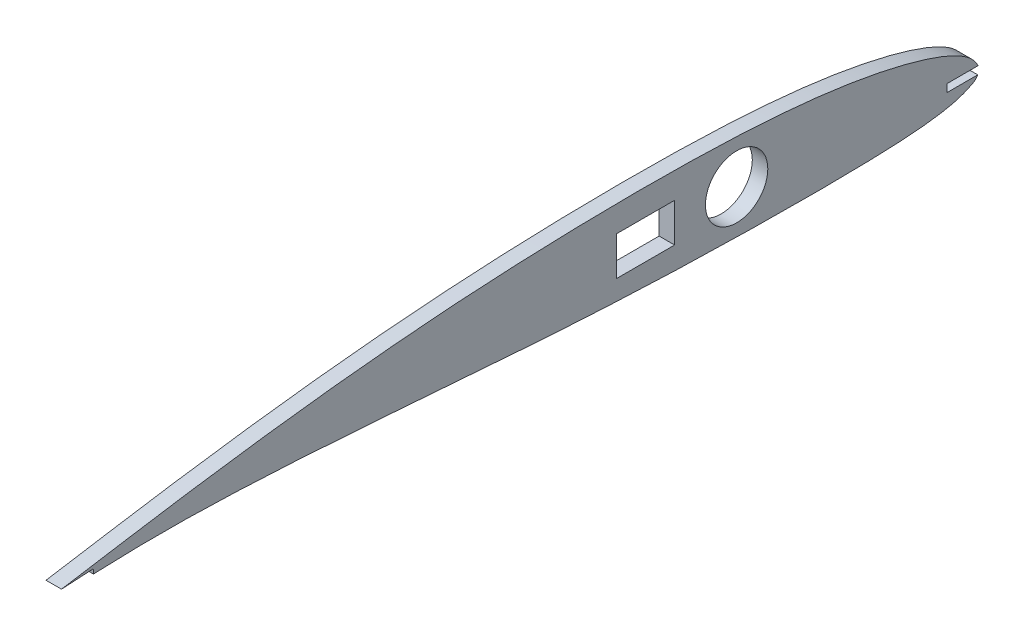
ISO-10303-21;
HEADER;
FILE_DESCRIPTION(('STEP AP214'),'2;1');
FILE_NAME('part.step','',(''),(''),'','','');
FILE_SCHEMA(('AUTOMOTIVE_DESIGN { 1 0 10303 214 1 1 1 1 }'));
ENDSEC;
DATA;
#1=APPLICATION_CONTEXT('core data for automotive mechanical design processes');
#2=APPLICATION_PROTOCOL_DEFINITION('international standard','automotive_design',2000,#1);
#3=PRODUCT_CONTEXT('',#1,'mechanical');
#4=PRODUCT('Part','Part','',(#3));
#5=PRODUCT_RELATED_PRODUCT_CATEGORY('part','',(#4));
#6=PRODUCT_DEFINITION_FORMATION('','',#4);
#7=PRODUCT_DEFINITION_CONTEXT('part definition',#1,'design');
#8=PRODUCT_DEFINITION('design','',#6,#7);
#9=PRODUCT_DEFINITION_SHAPE('','',#8);
#10=(LENGTH_UNIT() NAMED_UNIT(*) SI_UNIT(.MILLI.,.METRE.));
#11=(NAMED_UNIT(*) PLANE_ANGLE_UNIT() SI_UNIT($,.RADIAN.));
#12=(NAMED_UNIT(*) SI_UNIT($,.STERADIAN.) SOLID_ANGLE_UNIT());
#13=UNCERTAINTY_MEASURE_WITH_UNIT(LENGTH_MEASURE(1.E-05),#10,'distance_accuracy_value','');
#14=(GEOMETRIC_REPRESENTATION_CONTEXT(3) GLOBAL_UNCERTAINTY_ASSIGNED_CONTEXT((#13)) GLOBAL_UNIT_ASSIGNED_CONTEXT((#10,
#11,#12)) REPRESENTATION_CONTEXT('',''));
#15=CARTESIAN_POINT('',(0.,0.,0.));
#16=DIRECTION('',(0.,0.,1.));
#17=DIRECTION('',(1.,0.,0.));
#18=AXIS2_PLACEMENT_3D('',#15,#16,#17);
#19=CARTESIAN_POINT('',(4.,1.49711132773622,0.435092083404368));
#20=DIRECTION('',(-1.,0.,0.));
#21=DIRECTION('',(0.,0.,1.));
#22=AXIS2_PLACEMENT_3D('',#19,#20,#21);
#23=PLANE('',#22);
#24=DIRECTION('',(0.,1.,0.));
#25=VECTOR('',#24,1.);
#26=CARTESIAN_POINT('',(4.,10.0773227037384,78.4999197093942));
#27=LINE('',#26,#25);
#28=CARTESIAN_POINT('',(4.,0.0773227037384437,78.4999197093942));
#29=VERTEX_POINT('',#28);
#30=CARTESIAN_POINT('',(4.,10.0773227037384,78.4999197093942));
#31=VERTEX_POINT('',#30);
#32=EDGE_CURVE('E210',#29,#31,#27,.T.);
#33=ORIENTED_EDGE('',*,*,#32,.F.);
#34=DIRECTION('',(0.,0.,-1.));
#35=VECTOR('',#34,1.);
#36=CARTESIAN_POINT('',(4.,0.0773227037384437,78.4999197093942));
#37=LINE('',#36,#35);
#38=CARTESIAN_POINT('',(4.,0.0773227037384437,93.4999197093942));
#39=VERTEX_POINT('',#38);
#40=EDGE_CURVE('E223',#39,#29,#37,.T.);
#41=ORIENTED_EDGE('',*,*,#40,.F.);
#42=DIRECTION('',(0.,-1.,0.));
#43=VECTOR('',#42,1.);
#44=CARTESIAN_POINT('',(4.,10.0773227037384,93.4999197093942));
#45=LINE('',#44,#43);
#46=CARTESIAN_POINT('',(4.,10.0773227037384,93.4999197093942));
#47=VERTEX_POINT('',#46);
#48=EDGE_CURVE('E220',#47,#39,#45,.T.);
#49=ORIENTED_EDGE('',*,*,#48,.F.);
#50=DIRECTION('',(0.,0.,1.));
#51=VECTOR('',#50,1.);
#52=CARTESIAN_POINT('',(4.,10.0773227037384,78.4999197093942));
#53=LINE('',#52,#51);
#54=EDGE_CURVE('E217',#31,#47,#53,.T.);
#55=ORIENTED_EDGE('',*,*,#54,.F.);
#56=EDGE_LOOP('',(#33,#41,#49,#55));
#57=FACE_BOUND('',#56,.T.);
#58=CARTESIAN_POINT('',(4.,5.07732270373844,62.4999197093942));
#59=DIRECTION('',(1.,0.,0.));
#60=DIRECTION('',(0.,0.,-1.));
#61=AXIS2_PLACEMENT_3D('',#58,#59,#60);
#62=CIRCLE('',#61,8.05);
#63=CARTESIAN_POINT('',(4.,5.07732270373844,54.4499197093942));
#64=VERTEX_POINT('',#63);
#65=EDGE_CURVE('E207',#64,#64,#62,.T.);
#66=ORIENTED_EDGE('',*,*,#65,.F.);
#67=EDGE_LOOP('',(#66));
#68=FACE_BOUND('',#67,.T.);
#69=DIRECTION('',(0.,-0.0556361766390549,0.998451108391887));
#70=VECTOR('',#69,1.);
#71=CARTESIAN_POINT('',(4.,15.4115483761113,0.858769769023209));
#72=LINE('',#71,#70);
#73=CARTESIAN_POINT('',(4.,2.72436134676978,228.54400475566));
#74=VERTEX_POINT('',#73);
#75=CARTESIAN_POINT('',(4.,2.26814469600268,236.731303858083));
#76=VERTEX_POINT('',#75);
#77=EDGE_CURVE('E12',#74,#76,#72,.T.);
#78=ORIENTED_EDGE('',*,*,#77,.F.);
#79=DIRECTION('',(0.,0.998451108391887,0.0556361766390623));
#80=VECTOR('',#79,1.);
#81=CARTESIAN_POINT('',(4.,-12.6871870293432,227.685234986636));
#82=LINE('',#81,#80);
#83=CARTESIAN_POINT('',(4.,1.52621999630764,228.477241793327));
#84=VERTEX_POINT('',#83);
#85=EDGE_CURVE('E155',#84,#74,#82,.T.);
#86=ORIENTED_EDGE('',*,*,#85,.F.);
#87=CARTESIAN_POINT('',(4.,0.,250.));
#88=CARTESIAN_POINT('',(4.,-0.0080427959719715,250.000228293678));
#89=CARTESIAN_POINT('',(4.,0.172375657967406,248.284955515532));
#90=CARTESIAN_POINT('',(4.,0.308690014795419,246.518112419387));
#91=CARTESIAN_POINT('',(4.,0.685693593852336,242.189387343398));
#92=CARTESIAN_POINT('',(4.,1.07410152891603,236.806461263496));
#93=CARTESIAN_POINT('',(4.,1.49731723995003,229.680385951639));
#94=CARTESIAN_POINT('',(4.,1.8232186026768,221.18415869828));
#95=CARTESIAN_POINT('',(4.,1.96762610068065,211.337618207726));
#96=CARTESIAN_POINT('',(4.,1.83322105638369,200.371188527109));
#97=CARTESIAN_POINT('',(4.,1.38960528984164,188.499913622482));
#98=CARTESIAN_POINT('',(4.,0.706014078000893,175.953687417433));
#99=CARTESIAN_POINT('',(4.,-0.160208641561513,162.931424917666));
#100=CARTESIAN_POINT('',(4.,-1.14801632724376,149.615771743617));
#101=CARTESIAN_POINT('',(4.,-2.19092490983926,136.176354994724));
#102=CARTESIAN_POINT('',(4.,-3.21958397917046,122.767140548026));
#103=CARTESIAN_POINT('',(4.,-4.15274312671142,109.520053587455));
#104=CARTESIAN_POINT('',(4.,-4.93856436487493,96.5460959745437));
#105=CARTESIAN_POINT('',(4.,-5.53683070268675,83.9408193016427));
#106=CARTESIAN_POINT('',(4.,-5.94764820461108,71.8018392906514));
#107=CARTESIAN_POINT('',(4.,-6.21845093878312,60.2452560030716));
#108=CARTESIAN_POINT('',(4.,-6.35536975583973,49.3987328907547));
#109=CARTESIAN_POINT('',(4.,-6.38138796281789,39.3972261942655));
#110=CARTESIAN_POINT('',(4.,-6.26504923032313,30.3619348419668));
#111=CARTESIAN_POINT('',(4.,-6.01216491688521,22.4121811031587));
#112=CARTESIAN_POINT('',(4.,-5.59743390072595,15.6262272306516));
#113=CARTESIAN_POINT('',(4.,-4.92870657935606,10.0719075109048));
#114=CARTESIAN_POINT('',(4.,-4.04044698146404,5.69769261214423));
#115=CARTESIAN_POINT('',(4.,-2.8657529844069,2.62532063874475));
#116=CARTESIAN_POINT('',(4.,-1.7115284699546,0.494884225045661));
#117=CARTESIAN_POINT('',(4.,-0.410454230626488,-0.0213125491030087));
#118=CARTESIAN_POINT('',(4.,0.792659826704065,0.0311691995850224));
#119=CARTESIAN_POINT('',(4.,2.30568433693192,0.812599241892923));
#120=CARTESIAN_POINT('',(4.,4.23835242447377,2.72886351673443));
#121=CARTESIAN_POINT('',(4.,6.11817212106947,5.76990724125498));
#122=CARTESIAN_POINT('',(4.,7.91359420170391,9.88094280419771));
#123=CARTESIAN_POINT('',(4.,9.64131817838287,15.0749304677094));
#124=CARTESIAN_POINT('',(4.,11.2838964878058,21.2987522216172));
#125=CARTESIAN_POINT('',(4.,12.7883817585812,28.4971721202648));
#126=CARTESIAN_POINT('',(4.,14.0978349081275,36.6073734062479));
#127=CARTESIAN_POINT('',(4.,15.1594290171638,45.573028440303));
#128=CARTESIAN_POINT('',(4.,15.9609039979753,55.3329100744701));
#129=CARTESIAN_POINT('',(4.,16.4940697383882,65.8165364983871));
#130=CARTESIAN_POINT('',(4.,16.7919897051422,76.9313762604552));
#131=CARTESIAN_POINT('',(4.,16.864754130909,88.5669490281142));
#132=CARTESIAN_POINT('',(4.,16.7267152914356,100.596999885542));
#133=CARTESIAN_POINT('',(4.,16.3833850637257,112.888825982424));
#134=CARTESIAN_POINT('',(4.,15.825573666627,125.31161581915));
#135=CARTESIAN_POINT('',(4.,15.0523318700684,137.743791097076));
#136=CARTESIAN_POINT('',(4.,14.0593390742259,150.072384382085));
#137=CARTESIAN_POINT('',(4.,12.8815869860292,162.191375055682));
#138=CARTESIAN_POINT('',(4.,11.5492803460744,173.989074322246));
#139=CARTESIAN_POINT('',(4.,10.1162497290333,185.35236444642));
#140=CARTESIAN_POINT('',(4.,8.63237912523508,196.163081697706));
#141=CARTESIAN_POINT('',(4.,7.13151388385034,206.300441402258));
#142=CARTESIAN_POINT('',(4.,5.73122176805054,215.560350587015));
#143=CARTESIAN_POINT('',(4.,4.29329512716244,223.97715704258));
#144=CARTESIAN_POINT('',(4.,3.1818088737293,231.363413336396));
#145=CARTESIAN_POINT('',(4.,2.09894241729889,237.746440904332));
#146=CARTESIAN_POINT('',(4.,1.2458619166603,242.622069365861));
#147=CARTESIAN_POINT('',(4.,0.552864946230777,246.64452933247));
#148=CARTESIAN_POINT('',(4.,0.246216764640028,248.328398440367));
#149=CARTESIAN_POINT('',(4.,0.00797737724443801,249.999773563223));
#150=CARTESIAN_POINT('',(4.,0.,250.));
#151=B_SPLINE_CURVE_WITH_KNOTS('',3,(#87,#88,#89,#90,#91,#92,#93,#94,#95,#96,#97,#98,#99,#100,
#101,#102,#103,#104,#105,#106,#107,#108,#109,#110,#111,#112,#113,#114,#115,#116,#117,#118,#119,
#120,#121,#122,#123,#124,#125,#126,#127,#128,#129,#130,#131,#132,#133,#134,#135,#136,#137,#138,
#139,#140,#141,#142,#143,#144,#145,#146,#147,#148,#149,#150),.UNSPECIFIED.,.T.,.F.,(4,1,1,1,1,1,
1,1,1,1,1,1,1,1,1,1,1,1,1,1,1,1,1,1,1,1,1,1,1,1,1,1,1,1,1,1,1,1,1,1,1,1,1,1,1,1,1,1,1,1,1,1,1,1,
1,1,1,1,1,1,1,4),(0.,0.00158888881614516,0.00632921783555629,0.0142024564897436,
0.0251728077530557,0.0391734833267743,0.0560606311759249,0.0755789238487882,0.0973636066296903,
0.120926258366677,0.145825281006277,0.171670911815127,0.198108536705041,0.22479018357162,
0.25139057978404,0.277643490654311,0.303326750051388,0.328257458029316,0.352272548115194,
0.375156061746876,0.396620664402003,0.416422729294005,0.434304420097656,0.450054679859308,
0.463465465082325,0.474478994238096,0.483169222153171,0.489678354497499,0.494104066315722,
0.496910015324886,0.497289784891853,0.501214273282496,0.506457950332762,0.51335695674223,
0.522168631834455,0.53296596992453,0.545689209241574,0.56022077890382,0.57643892310517,
0.594258689005965,0.613600244568652,0.634342385932902,0.656331109263004,0.679351893859712,
0.703152302846811,0.727478208080039,0.7520707394079,0.776691163534608,0.801140183976245,
0.825214386971546,0.848697423570622,0.871352857669295,0.892947448931157,0.913230871058069,
0.931955467148994,0.94834206907442,0.963693004275676,0.976235918239566,0.986320058750392,
0.993788799349345,0.998424034933867,1.),.UNSPECIFIED.);
#152=CARTESIAN_POINT('',(4.,-1.00000520564392,0.266537777160303));
#153=VERTEX_POINT('',#152);
#154=EDGE_CURVE('E178',#84,#153,#151,.T.);
#155=ORIENTED_EDGE('',*,*,#154,.T.);
#156=DIRECTION('',(0.,0.,1.));
#157=VECTOR('',#156,1.);
#158=CARTESIAN_POINT('',(4.,-1.000005193435,-8.02951190162347E-05));
#159=LINE('',#158,#157);
#160=CARTESIAN_POINT('',(4.,-1.000005193435,8.19991970488098));
#161=VERTEX_POINT('',#160);
#162=EDGE_CURVE('E187',#153,#161,#159,.T.);
#163=ORIENTED_EDGE('',*,*,#162,.T.);
#164=DIRECTION('',(0.,1.,0.));
#165=VECTOR('',#164,1.);
#166=CARTESIAN_POINT('',(4.,0.999994806564996,8.19991970488098));
#167=LINE('',#166,#165);
#168=CARTESIAN_POINT('',(4.,0.999994806564996,8.19991970488098));
#169=VERTEX_POINT('',#168);
#170=EDGE_CURVE('E182',#161,#169,#167,.T.);
#171=ORIENTED_EDGE('',*,*,#170,.T.);
#172=DIRECTION('',(0.,0.,-1.));
#173=VECTOR('',#172,1.);
#174=CARTESIAN_POINT('',(4.,0.999994806564996,-8.0295119016847E-05));
#175=LINE('',#174,#173);
#176=CARTESIAN_POINT('',(4.,0.999994806564996,0.201514661045604));
#177=VERTEX_POINT('',#176);
#178=EDGE_CURVE('E174',#169,#177,#175,.T.);
#179=ORIENTED_EDGE('',*,*,#178,.T.);
#180=EDGE_CURVE('E171',#177,#76,#151,.T.);
#181=ORIENTED_EDGE('',*,*,#180,.T.);
#182=EDGE_LOOP('',(#78,#86,#155,#163,#171,#179,#181));
#183=FACE_BOUND('',#182,.T.);
#184=ADVANCED_FACE('F72',(#57,#68,#183),#23,.F.);
#185=CARTESIAN_POINT('',(0.,1.49711132773622,0.435092083404368));
#186=DIRECTION('',(-1.,0.,0.));
#187=DIRECTION('',(0.,0.,1.));
#188=AXIS2_PLACEMENT_3D('',#185,#186,#187);
#189=PLANE('',#188);
#190=CARTESIAN_POINT('',(0.,5.07732270373844,62.4999197093942));
#191=DIRECTION('',(1.,0.,0.));
#192=DIRECTION('',(0.,0.,-1.));
#193=AXIS2_PLACEMENT_3D('',#190,#191,#192);
#194=CIRCLE('',#193,8.05);
#195=CARTESIAN_POINT('',(0.,5.07732270373844,54.4499197093942));
#196=VERTEX_POINT('',#195);
#197=EDGE_CURVE('E177',#196,#196,#194,.T.);
#198=ORIENTED_EDGE('',*,*,#197,.T.);
#199=EDGE_LOOP('',(#198));
#200=FACE_BOUND('',#199,.T.);
#201=DIRECTION('',(0.,0.,-1.));
#202=VECTOR('',#201,1.);
#203=CARTESIAN_POINT('',(0.,0.0773227037384437,78.4999197093942));
#204=LINE('',#203,#202);
#205=CARTESIAN_POINT('',(0.,0.0773227037384437,93.4999197093942));
#206=VERTEX_POINT('',#205);
#207=CARTESIAN_POINT('',(0.,0.0773227037384437,78.4999197093942));
#208=VERTEX_POINT('',#207);
#209=EDGE_CURVE('E180',#206,#208,#204,.T.);
#210=ORIENTED_EDGE('',*,*,#209,.T.);
#211=DIRECTION('',(0.,1.,0.));
#212=VECTOR('',#211,1.);
#213=CARTESIAN_POINT('',(0.,10.0773227037384,78.4999197093942));
#214=LINE('',#213,#212);
#215=CARTESIAN_POINT('',(0.,10.0773227037384,78.4999197093942));
#216=VERTEX_POINT('',#215);
#217=EDGE_CURVE('E230',#208,#216,#214,.T.);
#218=ORIENTED_EDGE('',*,*,#217,.T.);
#219=DIRECTION('',(0.,0.,1.));
#220=VECTOR('',#219,1.);
#221=CARTESIAN_POINT('',(0.,10.0773227037384,78.4999197093942));
#222=LINE('',#221,#220);
#223=CARTESIAN_POINT('',(0.,10.0773227037384,93.4999197093942));
#224=VERTEX_POINT('',#223);
#225=EDGE_CURVE('E233',#216,#224,#222,.T.);
#226=ORIENTED_EDGE('',*,*,#225,.T.);
#227=DIRECTION('',(0.,-1.,0.));
#228=VECTOR('',#227,1.);
#229=CARTESIAN_POINT('',(0.,10.0773227037384,93.4999197093942));
#230=LINE('',#229,#228);
#231=EDGE_CURVE('E198',#224,#206,#230,.T.);
#232=ORIENTED_EDGE('',*,*,#231,.T.);
#233=EDGE_LOOP('',(#210,#218,#226,#232));
#234=FACE_BOUND('',#233,.T.);
#235=DIRECTION('',(0.,0.998451108391887,0.0556361766390623));
#236=VECTOR('',#235,1.);
#237=CARTESIAN_POINT('',(0.,-12.6871870293432,227.685234986636));
#238=LINE('',#237,#236);
#239=CARTESIAN_POINT('',(0.,1.52622001636533,228.477241351061));
#240=VERTEX_POINT('',#239);
#241=CARTESIAN_POINT('',(0.,2.72436134676978,228.54400475566));
#242=VERTEX_POINT('',#241);
#243=EDGE_CURVE('E196',#240,#242,#238,.T.);
#244=ORIENTED_EDGE('',*,*,#243,.T.);
#245=DIRECTION('',(0.,-0.0556361766390549,0.998451108391887));
#246=VECTOR('',#245,1.);
#247=CARTESIAN_POINT('',(0.,15.4115483761113,0.858769769023209));
#248=LINE('',#247,#246);
#249=CARTESIAN_POINT('',(0.,2.26814469600268,236.731303858083));
#250=VERTEX_POINT('',#249);
#251=EDGE_CURVE('E165',#242,#250,#248,.T.);
#252=ORIENTED_EDGE('',*,*,#251,.T.);
#253=CARTESIAN_POINT('',(0.,0.,250.));
#254=CARTESIAN_POINT('',(0.,-0.0080427959719715,250.000228293678));
#255=CARTESIAN_POINT('',(0.,0.172375657967406,248.284955515532));
#256=CARTESIAN_POINT('',(0.,0.308690014795419,246.518112419387));
#257=CARTESIAN_POINT('',(0.,0.685693593852336,242.189387343398));
#258=CARTESIAN_POINT('',(0.,1.07410152891603,236.806461263496));
#259=CARTESIAN_POINT('',(0.,1.49731723995003,229.680385951639));
#260=CARTESIAN_POINT('',(0.,1.8232186026768,221.18415869828));
#261=CARTESIAN_POINT('',(0.,1.96762610068065,211.337618207726));
#262=CARTESIAN_POINT('',(0.,1.83322105638369,200.371188527109));
#263=CARTESIAN_POINT('',(0.,1.38960528984164,188.499913622482));
#264=CARTESIAN_POINT('',(0.,0.706014078000893,175.953687417433));
#265=CARTESIAN_POINT('',(0.,-0.160208641561513,162.931424917666));
#266=CARTESIAN_POINT('',(0.,-1.14801632724376,149.615771743617));
#267=CARTESIAN_POINT('',(0.,-2.19092490983926,136.176354994724));
#268=CARTESIAN_POINT('',(0.,-3.21958397917046,122.767140548026));
#269=CARTESIAN_POINT('',(0.,-4.15274312671142,109.520053587455));
#270=CARTESIAN_POINT('',(0.,-4.93856436487493,96.5460959745437));
#271=CARTESIAN_POINT('',(0.,-5.53683070268675,83.9408193016427));
#272=CARTESIAN_POINT('',(0.,-5.94764820461108,71.8018392906514));
#273=CARTESIAN_POINT('',(0.,-6.21845093878312,60.2452560030716));
#274=CARTESIAN_POINT('',(0.,-6.35536975583973,49.3987328907547));
#275=CARTESIAN_POINT('',(0.,-6.38138796281789,39.3972261942655));
#276=CARTESIAN_POINT('',(0.,-6.26504923032313,30.3619348419668));
#277=CARTESIAN_POINT('',(0.,-6.01216491688521,22.4121811031587));
#278=CARTESIAN_POINT('',(0.,-5.59743390072595,15.6262272306516));
#279=CARTESIAN_POINT('',(0.,-4.92870657935606,10.0719075109048));
#280=CARTESIAN_POINT('',(0.,-4.04044698146404,5.69769261214423));
#281=CARTESIAN_POINT('',(0.,-2.8657529844069,2.62532063874475));
#282=CARTESIAN_POINT('',(0.,-1.7115284699546,0.494884225045661));
#283=CARTESIAN_POINT('',(0.,-0.410454230626488,-0.0213125491030087));
#284=CARTESIAN_POINT('',(0.,0.792659826704065,0.0311691995850224));
#285=CARTESIAN_POINT('',(0.,2.30568433693192,0.812599241892923));
#286=CARTESIAN_POINT('',(0.,4.23835242447377,2.72886351673443));
#287=CARTESIAN_POINT('',(0.,6.11817212106947,5.76990724125498));
#288=CARTESIAN_POINT('',(0.,7.91359420170391,9.88094280419771));
#289=CARTESIAN_POINT('',(0.,9.64131817838287,15.0749304677094));
#290=CARTESIAN_POINT('',(0.,11.2838964878058,21.2987522216172));
#291=CARTESIAN_POINT('',(0.,12.7883817585812,28.4971721202648));
#292=CARTESIAN_POINT('',(0.,14.0978349081275,36.6073734062479));
#293=CARTESIAN_POINT('',(0.,15.1594290171638,45.573028440303));
#294=CARTESIAN_POINT('',(0.,15.9609039979753,55.3329100744701));
#295=CARTESIAN_POINT('',(0.,16.4940697383882,65.8165364983871));
#296=CARTESIAN_POINT('',(0.,16.7919897051422,76.9313762604552));
#297=CARTESIAN_POINT('',(0.,16.864754130909,88.5669490281142));
#298=CARTESIAN_POINT('',(0.,16.7267152914356,100.596999885542));
#299=CARTESIAN_POINT('',(0.,16.3833850637257,112.888825982424));
#300=CARTESIAN_POINT('',(0.,15.825573666627,125.31161581915));
#301=CARTESIAN_POINT('',(0.,15.0523318700684,137.743791097076));
#302=CARTESIAN_POINT('',(0.,14.0593390742259,150.072384382085));
#303=CARTESIAN_POINT('',(0.,12.8815869860292,162.191375055682));
#304=CARTESIAN_POINT('',(0.,11.5492803460744,173.989074322246));
#305=CARTESIAN_POINT('',(0.,10.1162497290333,185.35236444642));
#306=CARTESIAN_POINT('',(0.,8.63237912523508,196.163081697706));
#307=CARTESIAN_POINT('',(0.,7.13151388385034,206.300441402258));
#308=CARTESIAN_POINT('',(0.,5.73122176805054,215.560350587015));
#309=CARTESIAN_POINT('',(0.,4.29329512716244,223.97715704258));
#310=CARTESIAN_POINT('',(0.,3.1818088737293,231.363413336396));
#311=CARTESIAN_POINT('',(0.,2.09894241729889,237.746440904332));
#312=CARTESIAN_POINT('',(0.,1.2458619166603,242.622069365861));
#313=CARTESIAN_POINT('',(0.,0.552864946230777,246.64452933247));
#314=CARTESIAN_POINT('',(0.,0.246216764640028,248.328398440367));
#315=CARTESIAN_POINT('',(0.,0.00797737724443801,249.999773563223));
#316=CARTESIAN_POINT('',(0.,0.,250.));
#317=B_SPLINE_CURVE_WITH_KNOTS('',3,(#253,#254,#255,#256,#257,#258,#259,#260,#261,#262,#263,
#264,#265,#266,#267,#268,#269,#270,#271,#272,#273,#274,#275,#276,#277,#278,#279,#280,#281,#282,
#283,#284,#285,#286,#287,#288,#289,#290,#291,#292,#293,#294,#295,#296,#297,#298,#299,#300,#301,
#302,#303,#304,#305,#306,#307,#308,#309,#310,#311,#312,#313,#314,#315,#316),.UNSPECIFIED.,.T.,
.F.,(4,1,1,1,1,1,1,1,1,1,1,1,1,1,1,1,1,1,1,1,1,1,1,1,1,1,1,1,1,1,1,1,1,1,1,1,1,1,1,1,1,1,1,1,1,
1,1,1,1,1,1,1,1,1,1,1,1,1,1,1,1,4),(0.,0.00158888881614516,0.00632921783555629,
0.0142024564897436,0.0251728077530557,0.0391734833267743,0.0560606311759249,0.0755789238487882,
0.0973636066296903,0.120926258366677,0.145825281006277,0.171670911815127,0.198108536705041,
0.22479018357162,0.25139057978404,0.277643490654311,0.303326750051388,0.328257458029316,
0.352272548115194,0.375156061746876,0.396620664402003,0.416422729294005,0.434304420097656,
0.450054679859308,0.463465465082325,0.474478994238096,0.483169222153171,0.489678354497499,
0.494104066315722,0.496910015324886,0.497289784891853,0.501214273282496,0.506457950332762,
0.51335695674223,0.522168631834455,0.53296596992453,0.545689209241574,0.56022077890382,
0.57643892310517,0.594258689005965,0.613600244568652,0.634342385932902,0.656331109263004,
0.679351893859712,0.703152302846811,0.727478208080039,0.7520707394079,0.776691163534608,
0.801140183976245,0.825214386971546,0.848697423570622,0.871352857669295,0.892947448931157,
0.913230871058069,0.931955467148994,0.94834206907442,0.963693004275676,0.976235918239566,
0.986320058750392,0.993788799349345,0.998424034933867,1.),.UNSPECIFIED.);
#318=CARTESIAN_POINT('',(0.,0.999994806564996,0.201514661045604));
#319=VERTEX_POINT('',#318);
#320=EDGE_CURVE('E75',#319,#250,#317,.T.);
#321=ORIENTED_EDGE('',*,*,#320,.F.);
#322=DIRECTION('',(0.,0.,-1.));
#323=VECTOR('',#322,1.);
#324=CARTESIAN_POINT('',(0.,0.999994806564996,-8.0295119016847E-05));
#325=LINE('',#324,#323);
#326=CARTESIAN_POINT('',(0.,0.999994806564996,8.19991970488098));
#327=VERTEX_POINT('',#326);
#328=EDGE_CURVE('E247',#327,#319,#325,.T.);
#329=ORIENTED_EDGE('',*,*,#328,.F.);
#330=DIRECTION('',(0.,1.,0.));
#331=VECTOR('',#330,1.);
#332=CARTESIAN_POINT('',(0.,0.999994806564996,8.19991970488098));
#333=LINE('',#332,#331);
#334=CARTESIAN_POINT('',(0.,-1.000005193435,8.19991970488098));
#335=VERTEX_POINT('',#334);
#336=EDGE_CURVE('E245',#335,#327,#333,.T.);
#337=ORIENTED_EDGE('',*,*,#336,.F.);
#338=DIRECTION('',(0.,0.,1.));
#339=VECTOR('',#338,1.);
#340=CARTESIAN_POINT('',(0.,-1.000005193435,-8.02951190162347E-05));
#341=LINE('',#340,#339);
#342=CARTESIAN_POINT('',(0.,-1.000005193435,0.266537777160357));
#343=VERTEX_POINT('',#342);
#344=EDGE_CURVE('E249',#343,#335,#341,.T.);
#345=ORIENTED_EDGE('',*,*,#344,.F.);
#346=EDGE_CURVE('E194',#240,#343,#317,.T.);
#347=ORIENTED_EDGE('',*,*,#346,.F.);
#348=EDGE_LOOP('',(#244,#252,#321,#329,#337,#345,#347));
#349=FACE_BOUND('',#348,.T.);
#350=ADVANCED_FACE('F260',(#200,#234,#349),#189,.T.);
#351=DIRECTION('',(-1.,0.,0.));
#352=VECTOR('',#351,1.);
#353=SURFACE_OF_LINEAR_EXTRUSION('',#151,#352);
#354=ORIENTED_EDGE('',*,*,#320,.T.);
#355=DIRECTION('',(-1.,0.,0.));
#356=VECTOR('',#355,1.);
#357=CARTESIAN_POINT('',(4.,2.26814469832933,236.731303844473));
#358=LINE('',#357,#356);
#359=EDGE_CURVE('E91',#250,#76,#358,.F.);
#360=ORIENTED_EDGE('',*,*,#359,.T.);
#361=ORIENTED_EDGE('',*,*,#180,.F.);
#362=DIRECTION('',(-1.,0.,0.));
#363=VECTOR('',#362,1.);
#364=CARTESIAN_POINT('',(4.,0.999994806564973,0.201514676074847));
#365=LINE('',#364,#363);
#366=EDGE_CURVE('E195',#177,#319,#365,.T.);
#367=ORIENTED_EDGE('',*,*,#366,.T.);
#368=EDGE_LOOP('',(#354,#360,#361,#367));
#369=FACE_BOUND('',#368,.T.);
#370=ADVANCED_FACE('F263',(#369),#353,.F.);
#371=DIRECTION('',(-1.,0.,0.));
#372=VECTOR('',#371,1.);
#373=CARTESIAN_POINT('',(4.,1.52621999630764,228.477241793327));
#374=LINE('',#373,#372);
#375=EDGE_CURVE('E153',#84,#240,#374,.T.);
#376=ORIENTED_EDGE('',*,*,#375,.T.);
#377=ORIENTED_EDGE('',*,*,#346,.T.);
#378=DIRECTION('',(-1.,0.,0.));
#379=VECTOR('',#378,1.);
#380=CARTESIAN_POINT('',(4.,-1.00000519343499,0.266537770752877));
#381=LINE('',#380,#379);
#382=EDGE_CURVE('E202',#343,#153,#381,.F.);
#383=ORIENTED_EDGE('',*,*,#382,.T.);
#384=ORIENTED_EDGE('',*,*,#154,.F.);
#385=EDGE_LOOP('',(#376,#377,#383,#384));
#386=FACE_BOUND('',#385,.T.);
#387=ADVANCED_FACE('F265',(#386),#353,.F.);
#388=CARTESIAN_POINT('',(4.,5.07732270373844,62.4999197093942));
#389=DIRECTION('',(-1.,0.,0.));
#390=DIRECTION('',(0.,0.,1.));
#391=AXIS2_PLACEMENT_3D('',#388,#389,#390);
#392=CYLINDRICAL_SURFACE('',#391,8.05);
#393=ORIENTED_EDGE('',*,*,#65,.T.);
#394=EDGE_LOOP('',(#393));
#395=FACE_BOUND('',#394,.T.);
#396=ORIENTED_EDGE('',*,*,#197,.F.);
#397=EDGE_LOOP('',(#396));
#398=FACE_BOUND('',#397,.T.);
#399=ADVANCED_FACE('F271',(#395,#398),#392,.F.);
#400=CARTESIAN_POINT('',(4.,10.0773227037384,78.4999197093942));
#401=DIRECTION('',(0.,0.,1.));
#402=DIRECTION('',(1.,0.,0.));
#403=AXIS2_PLACEMENT_3D('',#400,#401,#402);
#404=PLANE('',#403);
#405=ORIENTED_EDGE('',*,*,#217,.F.);
#406=DIRECTION('',(-1.,0.,0.));
#407=VECTOR('',#406,1.);
#408=CARTESIAN_POINT('',(4.,0.0773227037384437,78.4999197093942));
#409=LINE('',#408,#407);
#410=EDGE_CURVE('E224',#29,#208,#409,.T.);
#411=ORIENTED_EDGE('',*,*,#410,.F.);
#412=ORIENTED_EDGE('',*,*,#32,.T.);
#413=DIRECTION('',(-1.,0.,0.));
#414=VECTOR('',#413,1.);
#415=CARTESIAN_POINT('',(4.,10.0773227037384,78.4999197093942));
#416=LINE('',#415,#414);
#417=EDGE_CURVE('E214',#31,#216,#416,.T.);
#418=ORIENTED_EDGE('',*,*,#417,.T.);
#419=EDGE_LOOP('',(#405,#411,#412,#418));
#420=FACE_BOUND('',#419,.T.);
#421=ADVANCED_FACE('F286',(#420),#404,.T.);
#422=CARTESIAN_POINT('',(4.,10.0773227037384,78.4999197093942));
#423=DIRECTION('',(0.,-1.,0.));
#424=DIRECTION('',(0.,0.,-1.));
#425=AXIS2_PLACEMENT_3D('',#422,#423,#424);
#426=PLANE('',#425);
#427=ORIENTED_EDGE('',*,*,#225,.F.);
#428=ORIENTED_EDGE('',*,*,#417,.F.);
#429=ORIENTED_EDGE('',*,*,#54,.T.);
#430=DIRECTION('',(-1.,0.,0.));
#431=VECTOR('',#430,1.);
#432=CARTESIAN_POINT('',(4.,10.0773227037384,93.4999197093942));
#433=LINE('',#432,#431);
#434=EDGE_CURVE('E218',#47,#224,#433,.T.);
#435=ORIENTED_EDGE('',*,*,#434,.T.);
#436=EDGE_LOOP('',(#427,#428,#429,#435));
#437=FACE_BOUND('',#436,.T.);
#438=ADVANCED_FACE('F298',(#437),#426,.T.);
#439=CARTESIAN_POINT('',(4.,10.0773227037384,93.4999197093942));
#440=DIRECTION('',(0.,0.,-1.));
#441=DIRECTION('',(-1.,0.,0.));
#442=AXIS2_PLACEMENT_3D('',#439,#440,#441);
#443=PLANE('',#442);
#444=ORIENTED_EDGE('',*,*,#231,.F.);
#445=ORIENTED_EDGE('',*,*,#434,.F.);
#446=ORIENTED_EDGE('',*,*,#48,.T.);
#447=DIRECTION('',(-1.,0.,0.));
#448=VECTOR('',#447,1.);
#449=CARTESIAN_POINT('',(4.,0.0773227037384437,93.4999197093942));
#450=LINE('',#449,#448);
#451=EDGE_CURVE('E221',#39,#206,#450,.T.);
#452=ORIENTED_EDGE('',*,*,#451,.T.);
#453=EDGE_LOOP('',(#444,#445,#446,#452));
#454=FACE_BOUND('',#453,.T.);
#455=ADVANCED_FACE('F302',(#454),#443,.T.);
#456=CARTESIAN_POINT('',(4.,0.0773227037384437,78.4999197093942));
#457=DIRECTION('',(0.,1.,0.));
#458=DIRECTION('',(0.,0.,1.));
#459=AXIS2_PLACEMENT_3D('',#456,#457,#458);
#460=PLANE('',#459);
#461=ORIENTED_EDGE('',*,*,#209,.F.);
#462=ORIENTED_EDGE('',*,*,#451,.F.);
#463=ORIENTED_EDGE('',*,*,#40,.T.);
#464=ORIENTED_EDGE('',*,*,#410,.T.);
#465=EDGE_LOOP('',(#461,#462,#463,#464));
#466=FACE_BOUND('',#465,.T.);
#467=ADVANCED_FACE('F293',(#466),#460,.T.);
#468=CARTESIAN_POINT('',(4.,0.999994806564996,-8.0295119016847E-05));
#469=DIRECTION('',(0.,1.,0.));
#470=DIRECTION('',(0.,0.,1.));
#471=AXIS2_PLACEMENT_3D('',#468,#469,#470);
#472=PLANE('',#471);
#473=ORIENTED_EDGE('',*,*,#178,.F.);
#474=DIRECTION('',(-1.,0.,0.));
#475=VECTOR('',#474,1.);
#476=CARTESIAN_POINT('',(4.,0.999994806564996,8.19991970488098));
#477=LINE('',#476,#475);
#478=EDGE_CURVE('E227',#169,#327,#477,.T.);
#479=ORIENTED_EDGE('',*,*,#478,.T.);
#480=ORIENTED_EDGE('',*,*,#328,.T.);
#481=ORIENTED_EDGE('',*,*,#366,.F.);
#482=EDGE_LOOP('',(#473,#479,#480,#481));
#483=FACE_BOUND('',#482,.T.);
#484=ADVANCED_FACE('F262',(#483),#472,.F.);
#485=CARTESIAN_POINT('',(4.,-1.000005193435,-8.02951190162347E-05));
#486=DIRECTION('',(0.,-1.,0.));
#487=DIRECTION('',(0.,0.,-1.));
#488=AXIS2_PLACEMENT_3D('',#485,#486,#487);
#489=PLANE('',#488);
#490=ORIENTED_EDGE('',*,*,#344,.T.);
#491=DIRECTION('',(-1.,0.,0.));
#492=VECTOR('',#491,1.);
#493=CARTESIAN_POINT('',(4.,-1.000005193435,8.19991970488098));
#494=LINE('',#493,#492);
#495=EDGE_CURVE('E161',#161,#335,#494,.T.);
#496=ORIENTED_EDGE('',*,*,#495,.F.);
#497=ORIENTED_EDGE('',*,*,#162,.F.);
#498=ORIENTED_EDGE('',*,*,#382,.F.);
#499=EDGE_LOOP('',(#490,#496,#497,#498));
#500=FACE_BOUND('',#499,.T.);
#501=ADVANCED_FACE('F254',(#500),#489,.F.);
#502=CARTESIAN_POINT('',(4.,0.999994806564996,8.19991970488098));
#503=DIRECTION('',(0.,0.,1.));
#504=DIRECTION('',(1.,0.,0.));
#505=AXIS2_PLACEMENT_3D('',#502,#503,#504);
#506=PLANE('',#505);
#507=ORIENTED_EDGE('',*,*,#336,.T.);
#508=ORIENTED_EDGE('',*,*,#478,.F.);
#509=ORIENTED_EDGE('',*,*,#170,.F.);
#510=ORIENTED_EDGE('',*,*,#495,.T.);
#511=EDGE_LOOP('',(#507,#508,#509,#510));
#512=FACE_BOUND('',#511,.T.);
#513=ADVANCED_FACE('F258',(#512),#506,.F.);
#514=CARTESIAN_POINT('',(4.,-12.6871870293432,227.685234986636));
#515=DIRECTION('',(0.,-0.0556361766390623,0.998451108391887));
#516=DIRECTION('',(0.,-0.998451108391887,-0.0556361766390622));
#517=AXIS2_PLACEMENT_3D('',#514,#515,#516);
#518=PLANE('',#517);
#519=ORIENTED_EDGE('',*,*,#243,.F.);
#520=ORIENTED_EDGE('',*,*,#375,.F.);
#521=ORIENTED_EDGE('',*,*,#85,.T.);
#522=DIRECTION('',(-1.,0.,0.));
#523=VECTOR('',#522,1.);
#524=CARTESIAN_POINT('',(4.,2.72436134676978,228.54400475566));
#525=LINE('',#524,#523);
#526=EDGE_CURVE('E83',#74,#242,#525,.T.);
#527=ORIENTED_EDGE('',*,*,#526,.T.);
#528=EDGE_LOOP('',(#519,#520,#521,#527));
#529=FACE_BOUND('',#528,.T.);
#530=ADVANCED_FACE('F157',(#529),#518,.T.);
#531=CARTESIAN_POINT('',(4.,15.4115483761113,0.858769769023209));
#532=DIRECTION('',(0.,-0.998451108391887,-0.0556361766390549));
#533=DIRECTION('',(0.,0.0556361766390549,-0.998451108391887));
#534=AXIS2_PLACEMENT_3D('',#531,#532,#533);
#535=PLANE('',#534);
#536=ORIENTED_EDGE('',*,*,#251,.F.);
#537=ORIENTED_EDGE('',*,*,#526,.F.);
#538=ORIENTED_EDGE('',*,*,#77,.T.);
#539=ORIENTED_EDGE('',*,*,#359,.F.);
#540=EDGE_LOOP('',(#536,#537,#538,#539));
#541=FACE_BOUND('',#540,.T.);
#542=ADVANCED_FACE('F163',(#541),#535,.T.);
#543=CLOSED_SHELL('',(#184,#350,#370,#387,#399,#421,#438,#455,#467,#484,#501,#513,#530,#542));
#544=MANIFOLD_SOLID_BREP('B2',#543);
#545=ADVANCED_BREP_SHAPE_REPRESENTATION('',(#18,#544),#14);
#546=SHAPE_DEFINITION_REPRESENTATION(#9,#545);
ENDSEC;
END-ISO-10303-21;
